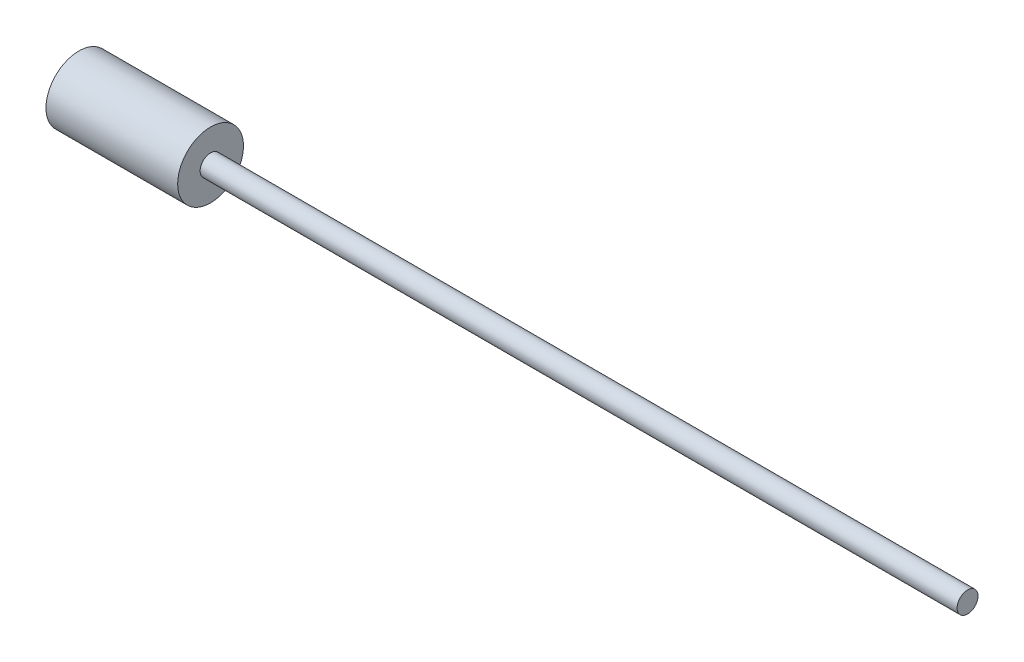
ISO-10303-21;
HEADER;
FILE_DESCRIPTION(('STEP AP214'),'2;1');
FILE_NAME('part.step','',(''),(''),'','','');
FILE_SCHEMA(('AUTOMOTIVE_DESIGN { 1 0 10303 214 1 1 1 1 }'));
ENDSEC;
DATA;
#1=APPLICATION_CONTEXT('core data for automotive mechanical design processes');
#2=APPLICATION_PROTOCOL_DEFINITION('international standard','automotive_design',2000,#1);
#3=PRODUCT_CONTEXT('',#1,'mechanical');
#4=PRODUCT('Part','Part','',(#3));
#5=PRODUCT_RELATED_PRODUCT_CATEGORY('part','',(#4));
#6=PRODUCT_DEFINITION_FORMATION('','',#4);
#7=PRODUCT_DEFINITION_CONTEXT('part definition',#1,'design');
#8=PRODUCT_DEFINITION('design','',#6,#7);
#9=PRODUCT_DEFINITION_SHAPE('','',#8);
#10=(LENGTH_UNIT() NAMED_UNIT(*) SI_UNIT(.MILLI.,.METRE.));
#11=(NAMED_UNIT(*) PLANE_ANGLE_UNIT() SI_UNIT($,.RADIAN.));
#12=(NAMED_UNIT(*) SI_UNIT($,.STERADIAN.) SOLID_ANGLE_UNIT());
#13=UNCERTAINTY_MEASURE_WITH_UNIT(LENGTH_MEASURE(1.E-05),#10,'distance_accuracy_value','');
#14=(GEOMETRIC_REPRESENTATION_CONTEXT(3) GLOBAL_UNCERTAINTY_ASSIGNED_CONTEXT((#13)) GLOBAL_UNIT_ASSIGNED_CONTEXT((#10,
#11,#12)) REPRESENTATION_CONTEXT('',''));
#15=CARTESIAN_POINT('',(0.,0.,0.));
#16=DIRECTION('',(0.,0.,1.));
#17=DIRECTION('',(1.,0.,0.));
#18=AXIS2_PLACEMENT_3D('',#15,#16,#17);
#19=CARTESIAN_POINT('',(90.,0.,0.));
#20=DIRECTION('',(-1.,0.,0.));
#21=DIRECTION('',(0.,0.,1.));
#22=AXIS2_PLACEMENT_3D('',#19,#20,#21);
#23=PLANE('',#22);
#24=CARTESIAN_POINT('',(90.0000000000001,0.,0.));
#25=DIRECTION('',(-1.,0.,0.));
#26=DIRECTION('',(0.,0.,1.));
#27=AXIS2_PLACEMENT_3D('',#24,#25,#26);
#28=CIRCLE('',#27,1.5875);
#29=CARTESIAN_POINT('',(90.0000000000001,0.,1.5875));
#30=VERTEX_POINT('',#29);
#31=EDGE_CURVE('E10',#30,#30,#28,.T.);
#32=ORIENTED_EDGE('',*,*,#31,.F.);
#33=EDGE_LOOP('',(#32));
#34=FACE_BOUND('',#33,.T.);
#35=ADVANCED_FACE('F39',(#34),#23,.F.);
#36=CARTESIAN_POINT('',(-1000.,0.,0.));
#37=DIRECTION('',(-1.,0.,0.));
#38=DIRECTION('',(0.,0.,1.));
#39=AXIS2_PLACEMENT_3D('',#36,#37,#38);
#40=CYLINDRICAL_SURFACE('',#39,1.5875);
#41=CARTESIAN_POINT('',(-25.,0.,0.));
#42=DIRECTION('',(-1.,0.,0.));
#43=DIRECTION('',(0.,0.,1.));
#44=AXIS2_PLACEMENT_3D('',#41,#42,#43);
#45=CIRCLE('',#44,1.5875);
#46=CARTESIAN_POINT('',(-25.,0.,1.5875));
#47=VERTEX_POINT('',#46);
#48=EDGE_CURVE('E44',#47,#47,#45,.T.);
#49=ORIENTED_EDGE('',*,*,#48,.F.);
#50=EDGE_LOOP('',(#49));
#51=FACE_BOUND('',#50,.T.);
#52=ORIENTED_EDGE('',*,*,#31,.T.);
#53=EDGE_LOOP('',(#52));
#54=FACE_BOUND('',#53,.T.);
#55=ADVANCED_FACE('F66',(#51,#54),#40,.T.);
#56=CARTESIAN_POINT('',(-25.,1.5875,0.));
#57=DIRECTION('',(-1.,0.,0.));
#58=DIRECTION('',(0.,0.,1.));
#59=AXIS2_PLACEMENT_3D('',#56,#57,#58);
#60=PLANE('',#59);
#61=CARTESIAN_POINT('',(-25.,0.,0.));
#62=DIRECTION('',(-1.,0.,0.));
#63=DIRECTION('',(0.,0.,1.));
#64=AXIS2_PLACEMENT_3D('',#61,#62,#63);
#65=CIRCLE('',#64,5.);
#66=CARTESIAN_POINT('',(-25.,0.,5.));
#67=VERTEX_POINT('',#66);
#68=EDGE_CURVE('E47',#67,#67,#65,.T.);
#69=ORIENTED_EDGE('',*,*,#68,.F.);
#70=EDGE_LOOP('',(#69));
#71=FACE_BOUND('',#70,.T.);
#72=ORIENTED_EDGE('',*,*,#48,.T.);
#73=EDGE_LOOP('',(#72));
#74=FACE_BOUND('',#73,.T.);
#75=ADVANCED_FACE('F61',(#71,#74),#60,.F.);
#76=CARTESIAN_POINT('',(-1000.,0.,0.));
#77=DIRECTION('',(-1.,0.,0.));
#78=DIRECTION('',(0.,0.,1.));
#79=AXIS2_PLACEMENT_3D('',#76,#77,#78);
#80=CYLINDRICAL_SURFACE('',#79,5.);
#81=CARTESIAN_POINT('',(-45.,0.,0.));
#82=DIRECTION('',(-1.,0.,0.));
#83=DIRECTION('',(0.,0.,1.));
#84=AXIS2_PLACEMENT_3D('',#81,#82,#83);
#85=CIRCLE('',#84,5.);
#86=CARTESIAN_POINT('',(-45.,0.,5.));
#87=VERTEX_POINT('',#86);
#88=EDGE_CURVE('E52',#87,#87,#85,.T.);
#89=ORIENTED_EDGE('',*,*,#88,.F.);
#90=EDGE_LOOP('',(#89));
#91=FACE_BOUND('',#90,.T.);
#92=ORIENTED_EDGE('',*,*,#68,.T.);
#93=EDGE_LOOP('',(#92));
#94=FACE_BOUND('',#93,.T.);
#95=ADVANCED_FACE('F62',(#91,#94),#80,.T.);
#96=CARTESIAN_POINT('',(-45.,5.,0.));
#97=DIRECTION('',(1.,0.,0.));
#98=DIRECTION('',(0.,0.,-1.));
#99=AXIS2_PLACEMENT_3D('',#96,#97,#98);
#100=PLANE('',#99);
#101=ORIENTED_EDGE('',*,*,#88,.T.);
#102=EDGE_LOOP('',(#101));
#103=FACE_BOUND('',#102,.T.);
#104=ADVANCED_FACE('F56',(#103),#100,.F.);
#105=CLOSED_SHELL('',(#35,#55,#75,#95,#104));
#106=MANIFOLD_SOLID_BREP('B2',#105);
#107=ADVANCED_BREP_SHAPE_REPRESENTATION('',(#18,#106),#14);
#108=SHAPE_DEFINITION_REPRESENTATION(#9,#107);
ENDSEC;
END-ISO-10303-21;
